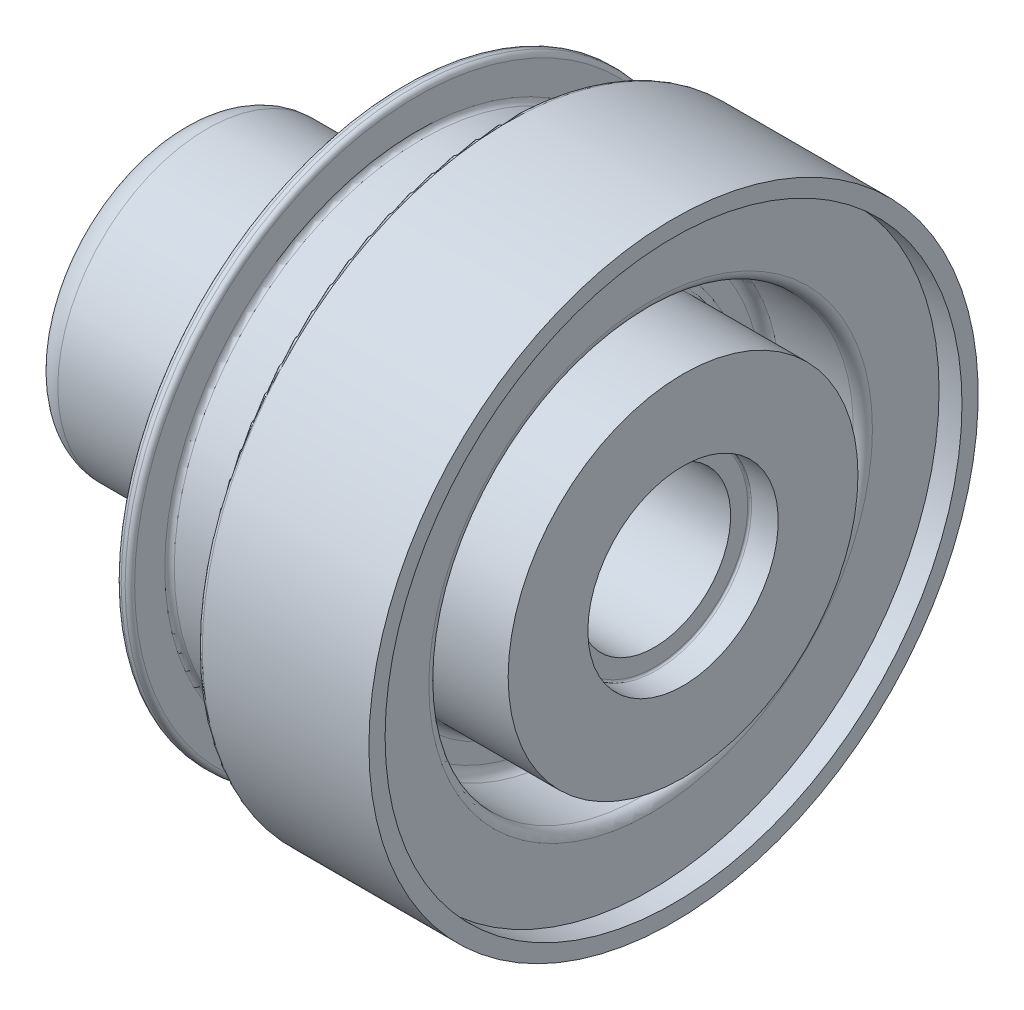
ISO-10303-21;
HEADER;
FILE_DESCRIPTION(('STEP AP214'),'2;1');
FILE_NAME('part.step','',(''),(''),'','','');
FILE_SCHEMA(('AUTOMOTIVE_DESIGN { 1 0 10303 214 1 1 1 1 }'));
ENDSEC;
DATA;
#1=APPLICATION_CONTEXT('core data for automotive mechanical design processes');
#2=APPLICATION_PROTOCOL_DEFINITION('international standard','automotive_design',2000,#1);
#3=PRODUCT_CONTEXT('',#1,'mechanical');
#4=PRODUCT('Part','Part','',(#3));
#5=PRODUCT_RELATED_PRODUCT_CATEGORY('part','',(#4));
#6=PRODUCT_DEFINITION_FORMATION('','',#4);
#7=PRODUCT_DEFINITION_CONTEXT('part definition',#1,'design');
#8=PRODUCT_DEFINITION('design','',#6,#7);
#9=PRODUCT_DEFINITION_SHAPE('','',#8);
#10=(LENGTH_UNIT() NAMED_UNIT(*) SI_UNIT(.MILLI.,.METRE.));
#11=(NAMED_UNIT(*) PLANE_ANGLE_UNIT() SI_UNIT($,.RADIAN.));
#12=(NAMED_UNIT(*) SI_UNIT($,.STERADIAN.) SOLID_ANGLE_UNIT());
#13=UNCERTAINTY_MEASURE_WITH_UNIT(LENGTH_MEASURE(1.E-05),#10,'distance_accuracy_value','');
#14=(GEOMETRIC_REPRESENTATION_CONTEXT(3) GLOBAL_UNCERTAINTY_ASSIGNED_CONTEXT((#13)) GLOBAL_UNIT_ASSIGNED_CONTEXT((#10,
#11,#12)) REPRESENTATION_CONTEXT('',''));
#15=CARTESIAN_POINT('',(0.,0.,0.));
#16=DIRECTION('',(0.,0.,1.));
#17=DIRECTION('',(1.,0.,0.));
#18=AXIS2_PLACEMENT_3D('',#15,#16,#17);
#19=CARTESIAN_POINT('',(-14.5,0.,-6.));
#20=DIRECTION('',(1.,0.,0.));
#21=DIRECTION('',(0.,0.,-1.));
#22=AXIS2_PLACEMENT_3D('',#19,#20,#21);
#23=PLANE('',#22);
#24=CARTESIAN_POINT('',(-14.5,0.,0.));
#25=DIRECTION('',(-1.,0.,0.));
#26=DIRECTION('',(0.,0.,1.));
#27=AXIS2_PLACEMENT_3D('',#24,#25,#26);
#28=CIRCLE('',#27,4.);
#29=CARTESIAN_POINT('',(-14.5,0.,4.));
#30=VERTEX_POINT('',#29);
#31=EDGE_CURVE('E133',#30,#30,#28,.T.);
#32=ORIENTED_EDGE('',*,*,#31,.F.);
#33=EDGE_LOOP('',(#32));
#34=FACE_BOUND('',#33,.T.);
#35=CARTESIAN_POINT('',(-14.5,0.,0.));
#36=DIRECTION('',(-1.,0.,0.));
#37=DIRECTION('',(0.,0.,1.));
#38=AXIS2_PLACEMENT_3D('',#35,#36,#37);
#39=CIRCLE('',#38,6.);
#40=CARTESIAN_POINT('',(-14.5,0.,6.));
#41=VERTEX_POINT('',#40);
#42=EDGE_CURVE('E10',#41,#41,#39,.T.);
#43=ORIENTED_EDGE('',*,*,#42,.T.);
#44=EDGE_LOOP('',(#43));
#45=FACE_BOUND('',#44,.T.);
#46=ADVANCED_FACE('F30',(#34,#45),#23,.F.);
#47=CARTESIAN_POINT('',(0.,0.,0.));
#48=DIRECTION('',(-1.,0.,0.));
#49=DIRECTION('',(0.,0.,1.));
#50=AXIS2_PLACEMENT_3D('',#47,#48,#49);
#51=CYLINDRICAL_SURFACE('',#50,6.);
#52=ORIENTED_EDGE('',*,*,#42,.F.);
#53=EDGE_LOOP('',(#52));
#54=FACE_BOUND('',#53,.T.);
#55=CARTESIAN_POINT('',(-26.5,0.,0.));
#56=DIRECTION('',(-1.,0.,0.));
#57=DIRECTION('',(0.,0.,1.));
#58=AXIS2_PLACEMENT_3D('',#55,#56,#57);
#59=CIRCLE('',#58,6.);
#60=CARTESIAN_POINT('',(-26.5,0.,6.));
#61=VERTEX_POINT('',#60);
#62=EDGE_CURVE('E36',#61,#61,#59,.T.);
#63=ORIENTED_EDGE('',*,*,#62,.T.);
#64=EDGE_LOOP('',(#63));
#65=FACE_BOUND('',#64,.T.);
#66=ADVANCED_FACE('F140',(#54,#65),#51,.F.);
#67=CARTESIAN_POINT('',(-26.5,0.,-6.33810288189224));
#68=DIRECTION('',(1.,0.,0.));
#69=DIRECTION('',(0.,0.,-1.));
#70=AXIS2_PLACEMENT_3D('',#67,#68,#69);
#71=PLANE('',#70);
#72=ORIENTED_EDGE('',*,*,#62,.F.);
#73=EDGE_LOOP('',(#72));
#74=FACE_BOUND('',#73,.T.);
#75=CARTESIAN_POINT('',(-26.5,0.,0.));
#76=DIRECTION('',(-1.,0.,0.));
#77=DIRECTION('',(0.,0.,1.));
#78=AXIS2_PLACEMENT_3D('',#75,#76,#77);
#79=CIRCLE('',#78,6.33810288189224);
#80=CARTESIAN_POINT('',(-26.5,0.,6.33810288189224));
#81=VERTEX_POINT('',#80);
#82=EDGE_CURVE('E40',#81,#81,#79,.T.);
#83=ORIENTED_EDGE('',*,*,#82,.T.);
#84=EDGE_LOOP('',(#83));
#85=FACE_BOUND('',#84,.T.);
#86=ADVANCED_FACE('F144',(#74,#85),#71,.F.);
#87=CARTESIAN_POINT('',(-25.,0.,0.));
#88=DIRECTION('',(-1.,0.,0.));
#89=DIRECTION('',(0.,0.,1.));
#90=AXIS2_PLACEMENT_3D('',#87,#88,#89);
#91=TOROIDAL_SURFACE('',#90,6.33810288189224,1.5);
#92=ORIENTED_EDGE('',*,*,#82,.F.);
#93=EDGE_LOOP('',(#92));
#94=FACE_BOUND('',#93,.T.);
#95=CARTESIAN_POINT('',(-25.,0.,0.));
#96=DIRECTION('',(-1.,0.,0.));
#97=DIRECTION('',(0.,0.,1.));
#98=AXIS2_PLACEMENT_3D('',#95,#96,#97);
#99=CIRCLE('',#98,7.83810288189224);
#100=CARTESIAN_POINT('',(-25.,0.,7.83810288189224));
#101=VERTEX_POINT('',#100);
#102=EDGE_CURVE('E44',#101,#101,#99,.T.);
#103=ORIENTED_EDGE('',*,*,#102,.T.);
#104=EDGE_LOOP('',(#103));
#105=FACE_BOUND('',#104,.T.);
#106=ADVANCED_FACE('F149',(#94,#105),#91,.T.);
#107=CARTESIAN_POINT('',(0.,0.,0.));
#108=DIRECTION('',(-1.,0.,0.));
#109=DIRECTION('',(0.,0.,1.));
#110=AXIS2_PLACEMENT_3D('',#107,#108,#109);
#111=CYLINDRICAL_SURFACE('',#110,7.83810288189224);
#112=ORIENTED_EDGE('',*,*,#102,.F.);
#113=EDGE_LOOP('',(#112));
#114=FACE_BOUND('',#113,.T.);
#115=CARTESIAN_POINT('',(-15.6202647500107,0.,0.));
#116=DIRECTION('',(-1.,0.,0.));
#117=DIRECTION('',(0.,0.,1.));
#118=AXIS2_PLACEMENT_3D('',#115,#116,#117);
#119=CIRCLE('',#118,7.83810288189224);
#120=CARTESIAN_POINT('',(-15.6202647500107,0.,7.83810288189224));
#121=VERTEX_POINT('',#120);
#122=EDGE_CURVE('E49',#121,#121,#119,.T.);
#123=ORIENTED_EDGE('',*,*,#122,.T.);
#124=EDGE_LOOP('',(#123));
#125=FACE_BOUND('',#124,.T.);
#126=ADVANCED_FACE('F155',(#114,#125),#111,.T.);
#127=CARTESIAN_POINT('',(-15.6202647500107,0.,0.));
#128=DIRECTION('',(-1.,0.,0.));
#129=DIRECTION('',(0.,0.,1.));
#130=AXIS2_PLACEMENT_3D('',#127,#128,#129);
#131=TOROIDAL_SURFACE('',#130,8.08810288189224,0.249999999999999);
#132=ORIENTED_EDGE('',*,*,#122,.F.);
#133=EDGE_LOOP('',(#132));
#134=FACE_BOUND('',#133,.T.);
#135=CARTESIAN_POINT('',(-15.3702647500107,0.,0.));
#136=DIRECTION('',(-1.,0.,0.));
#137=DIRECTION('',(0.,0.,1.));
#138=AXIS2_PLACEMENT_3D('',#135,#136,#137);
#139=CIRCLE('',#138,8.08810288189224);
#140=CARTESIAN_POINT('',(-15.3702647500107,0.,8.08810288189224));
#141=VERTEX_POINT('',#140);
#142=EDGE_CURVE('E52',#141,#141,#139,.T.);
#143=ORIENTED_EDGE('',*,*,#142,.T.);
#144=EDGE_LOOP('',(#143));
#145=FACE_BOUND('',#144,.T.);
#146=ADVANCED_FACE('F159',(#134,#145),#131,.F.);
#147=CARTESIAN_POINT('',(-15.3702647500107,0.,-13.4373337384986));
#148=DIRECTION('',(1.,0.,0.));
#149=DIRECTION('',(0.,0.,-1.));
#150=AXIS2_PLACEMENT_3D('',#147,#148,#149);
#151=PLANE('',#150);
#152=ORIENTED_EDGE('',*,*,#142,.F.);
#153=EDGE_LOOP('',(#152));
#154=FACE_BOUND('',#153,.T.);
#155=CARTESIAN_POINT('',(-15.3702647500107,0.,0.));
#156=DIRECTION('',(-1.,0.,0.));
#157=DIRECTION('',(0.,0.,1.));
#158=AXIS2_PLACEMENT_3D('',#155,#156,#157);
#159=CIRCLE('',#158,13.4373337384986);
#160=CARTESIAN_POINT('',(-15.3702647500107,0.,13.4373337384986));
#161=VERTEX_POINT('',#160);
#162=EDGE_CURVE('E55',#161,#161,#159,.T.);
#163=ORIENTED_EDGE('',*,*,#162,.T.);
#164=EDGE_LOOP('',(#163));
#165=FACE_BOUND('',#164,.T.);
#166=ADVANCED_FACE('F163',(#154,#165),#151,.F.);
#167=CARTESIAN_POINT('',(-15.1202647500107,0.,0.));
#168=DIRECTION('',(-1.,0.,0.));
#169=DIRECTION('',(0.,0.,1.));
#170=AXIS2_PLACEMENT_3D('',#167,#168,#169);
#171=TOROIDAL_SURFACE('',#170,13.4373337384986,0.249999999999996);
#172=ORIENTED_EDGE('',*,*,#162,.F.);
#173=EDGE_LOOP('',(#172));
#174=FACE_BOUND('',#173,.T.);
#175=CARTESIAN_POINT('',(-15.3443863576064,0.,0.));
#176=DIRECTION('',(-1.,0.,0.));
#177=DIRECTION('',(0.,0.,1.));
#178=AXIS2_PLACEMENT_3D('',#175,#176,#177);
#179=CIRCLE('',#178,13.548101536205);
#180=CARTESIAN_POINT('',(-15.3443863576064,0.,13.548101536205));
#181=VERTEX_POINT('',#180);
#182=EDGE_CURVE('E58',#181,#181,#179,.T.);
#183=ORIENTED_EDGE('',*,*,#182,.T.);
#184=EDGE_LOOP('',(#183));
#185=FACE_BOUND('',#184,.T.);
#186=ADVANCED_FACE('F167',(#174,#185),#171,.T.);
#187=CARTESIAN_POINT('',(-14.6560840134625,0.,0.));
#188=DIRECTION('',(1.,0.,0.));
#189=DIRECTION('',(0.,0.,-1.));
#190=AXIS2_PLACEMENT_3D('',#187,#188,#189);
#191=CONICAL_SURFACE('',#190,14.9407754998986,1.11177473351877);
#192=ORIENTED_EDGE('',*,*,#182,.F.);
#193=EDGE_LOOP('',(#192));
#194=FACE_BOUND('',#193,.T.);
#195=CARTESIAN_POINT('',(-14.6560840134625,0.,0.));
#196=DIRECTION('',(-1.,0.,0.));
#197=DIRECTION('',(0.,0.,1.));
#198=AXIS2_PLACEMENT_3D('',#195,#196,#197);
#199=CIRCLE('',#198,14.9407754998986);
#200=CARTESIAN_POINT('',(-14.6560840134625,0.,14.9407754998986));
#201=VERTEX_POINT('',#200);
#202=EDGE_CURVE('E61',#201,#201,#199,.T.);
#203=ORIENTED_EDGE('',*,*,#202,.T.);
#204=EDGE_LOOP('',(#203));
#205=FACE_BOUND('',#204,.T.);
#206=ADVANCED_FACE('F171',(#194,#205),#191,.T.);
#207=CARTESIAN_POINT('',(-14.4319624058668,0.,0.));
#208=DIRECTION('',(-1.,0.,0.));
#209=DIRECTION('',(0.,0.,1.));
#210=AXIS2_PLACEMENT_3D('',#207,#208,#209);
#211=TOROIDAL_SURFACE('',#210,14.8300077021922,0.249999999999999);
#212=ORIENTED_EDGE('',*,*,#202,.F.);
#213=EDGE_LOOP('',(#212));
#214=FACE_BOUND('',#213,.T.);
#215=CARTESIAN_POINT('',(-14.43,0.,0.));
#216=DIRECTION('',(-1.,0.,0.));
#217=DIRECTION('',(0.,0.,1.));
#218=AXIS2_PLACEMENT_3D('',#215,#216,#217);
#219=CIRCLE('',#218,15.08);
#220=CARTESIAN_POINT('',(-14.43,0.,15.08));
#221=VERTEX_POINT('',#220);
#222=EDGE_CURVE('E64',#221,#221,#219,.T.);
#223=ORIENTED_EDGE('',*,*,#222,.T.);
#224=EDGE_LOOP('',(#223));
#225=FACE_BOUND('',#224,.T.);
#226=ADVANCED_FACE('F175',(#214,#225),#211,.T.);
#227=CARTESIAN_POINT('',(0.,0.,0.));
#228=DIRECTION('',(-1.,0.,0.));
#229=DIRECTION('',(0.,0.,1.));
#230=AXIS2_PLACEMENT_3D('',#227,#228,#229);
#231=CYLINDRICAL_SURFACE('',#230,15.08);
#232=ORIENTED_EDGE('',*,*,#222,.F.);
#233=EDGE_LOOP('',(#232));
#234=FACE_BOUND('',#233,.T.);
#235=CARTESIAN_POINT('',(-14.22,0.,0.));
#236=DIRECTION('',(-1.,0.,0.));
#237=DIRECTION('',(0.,0.,1.));
#238=AXIS2_PLACEMENT_3D('',#235,#236,#237);
#239=CIRCLE('',#238,15.08);
#240=CARTESIAN_POINT('',(-14.22,0.,15.08));
#241=VERTEX_POINT('',#240);
#242=EDGE_CURVE('E67',#241,#241,#239,.T.);
#243=ORIENTED_EDGE('',*,*,#242,.T.);
#244=EDGE_LOOP('',(#243));
#245=FACE_BOUND('',#244,.T.);
#246=ADVANCED_FACE('F179',(#234,#245),#231,.T.);
#247=CARTESIAN_POINT('',(-14.22,0.,0.));
#248=DIRECTION('',(-1.,0.,0.));
#249=DIRECTION('',(0.,0.,1.));
#250=AXIS2_PLACEMENT_3D('',#247,#248,#249);
#251=TOROIDAL_SURFACE('',#250,14.83,0.250000000000001);
#252=ORIENTED_EDGE('',*,*,#242,.F.);
#253=EDGE_LOOP('',(#252));
#254=FACE_BOUND('',#253,.T.);
#255=CARTESIAN_POINT('',(-13.97,0.,0.));
#256=DIRECTION('',(-1.,0.,0.));
#257=DIRECTION('',(0.,0.,1.));
#258=AXIS2_PLACEMENT_3D('',#255,#256,#257);
#259=CIRCLE('',#258,14.83);
#260=CARTESIAN_POINT('',(-13.97,0.,14.83));
#261=VERTEX_POINT('',#260);
#262=EDGE_CURVE('E70',#261,#261,#259,.T.);
#263=ORIENTED_EDGE('',*,*,#262,.T.);
#264=EDGE_LOOP('',(#263));
#265=FACE_BOUND('',#264,.T.);
#266=ADVANCED_FACE('F183',(#254,#265),#251,.T.);
#267=CARTESIAN_POINT('',(-13.97,0.,-13.25));
#268=DIRECTION('',(-1.,0.,0.));
#269=DIRECTION('',(0.,0.,1.));
#270=AXIS2_PLACEMENT_3D('',#267,#268,#269);
#271=PLANE('',#270);
#272=ORIENTED_EDGE('',*,*,#262,.F.);
#273=EDGE_LOOP('',(#272));
#274=FACE_BOUND('',#273,.T.);
#275=CARTESIAN_POINT('',(-13.97,0.,0.));
#276=DIRECTION('',(-1.,0.,0.));
#277=DIRECTION('',(0.,0.,1.));
#278=AXIS2_PLACEMENT_3D('',#275,#276,#277);
#279=CIRCLE('',#278,13.25);
#280=CARTESIAN_POINT('',(-13.97,0.,13.25));
#281=VERTEX_POINT('',#280);
#282=EDGE_CURVE('E73',#281,#281,#279,.T.);
#283=ORIENTED_EDGE('',*,*,#282,.T.);
#284=EDGE_LOOP('',(#283));
#285=FACE_BOUND('',#284,.T.);
#286=ADVANCED_FACE('F187',(#274,#285),#271,.F.);
#287=CARTESIAN_POINT('',(-13.72,0.,0.));
#288=DIRECTION('',(-1.,0.,0.));
#289=DIRECTION('',(0.,0.,1.));
#290=AXIS2_PLACEMENT_3D('',#287,#288,#289);
#291=TOROIDAL_SURFACE('',#290,13.25,0.249999999999999);
#292=ORIENTED_EDGE('',*,*,#282,.F.);
#293=EDGE_LOOP('',(#292));
#294=FACE_BOUND('',#293,.T.);
#295=CARTESIAN_POINT('',(-13.72,0.,0.));
#296=DIRECTION('',(-1.,0.,0.));
#297=DIRECTION('',(0.,0.,1.));
#298=AXIS2_PLACEMENT_3D('',#295,#296,#297);
#299=CIRCLE('',#298,13.);
#300=CARTESIAN_POINT('',(-13.72,0.,13.));
#301=VERTEX_POINT('',#300);
#302=EDGE_CURVE('E76',#301,#301,#299,.T.);
#303=ORIENTED_EDGE('',*,*,#302,.T.);
#304=EDGE_LOOP('',(#303));
#305=FACE_BOUND('',#304,.T.);
#306=ADVANCED_FACE('F191',(#294,#305),#291,.F.);
#307=CARTESIAN_POINT('',(0.,0.,0.));
#308=DIRECTION('',(-1.,0.,0.));
#309=DIRECTION('',(0.,0.,1.));
#310=AXIS2_PLACEMENT_3D('',#307,#308,#309);
#311=CYLINDRICAL_SURFACE('',#310,13.);
#312=ORIENTED_EDGE('',*,*,#302,.F.);
#313=EDGE_LOOP('',(#312));
#314=FACE_BOUND('',#313,.T.);
#315=CARTESIAN_POINT('',(-9.75,0.,0.));
#316=DIRECTION('',(-1.,0.,0.));
#317=DIRECTION('',(0.,0.,1.));
#318=AXIS2_PLACEMENT_3D('',#315,#316,#317);
#319=CIRCLE('',#318,13.);
#320=CARTESIAN_POINT('',(-9.75,0.,13.));
#321=VERTEX_POINT('',#320);
#322=EDGE_CURVE('E79',#321,#321,#319,.T.);
#323=ORIENTED_EDGE('',*,*,#322,.T.);
#324=EDGE_LOOP('',(#323));
#325=FACE_BOUND('',#324,.T.);
#326=ADVANCED_FACE('F195',(#314,#325),#311,.T.);
#327=CARTESIAN_POINT('',(-9.75,0.,0.));
#328=DIRECTION('',(-1.,0.,0.));
#329=DIRECTION('',(0.,0.,1.));
#330=AXIS2_PLACEMENT_3D('',#327,#328,#329);
#331=TOROIDAL_SURFACE('',#330,13.25,0.249999999999998);
#332=ORIENTED_EDGE('',*,*,#322,.F.);
#333=EDGE_LOOP('',(#332));
#334=FACE_BOUND('',#333,.T.);
#335=CARTESIAN_POINT('',(-9.5,0.,0.));
#336=DIRECTION('',(-1.,0.,0.));
#337=DIRECTION('',(0.,0.,1.));
#338=AXIS2_PLACEMENT_3D('',#335,#336,#337);
#339=CIRCLE('',#338,13.25);
#340=CARTESIAN_POINT('',(-9.5,0.,13.25));
#341=VERTEX_POINT('',#340);
#342=EDGE_CURVE('E82',#341,#341,#339,.T.);
#343=ORIENTED_EDGE('',*,*,#342,.T.);
#344=EDGE_LOOP('',(#343));
#345=FACE_BOUND('',#344,.T.);
#346=ADVANCED_FACE('F199',(#334,#345),#331,.F.);
#347=CARTESIAN_POINT('',(-9.5,0.,-15.75));
#348=DIRECTION('',(1.,0.,0.));
#349=DIRECTION('',(0.,0.,-1.));
#350=AXIS2_PLACEMENT_3D('',#347,#348,#349);
#351=PLANE('',#350);
#352=ORIENTED_EDGE('',*,*,#342,.F.);
#353=EDGE_LOOP('',(#352));
#354=FACE_BOUND('',#353,.T.);
#355=CARTESIAN_POINT('',(-9.5,0.,0.));
#356=DIRECTION('',(-1.,0.,0.));
#357=DIRECTION('',(0.,0.,1.));
#358=AXIS2_PLACEMENT_3D('',#355,#356,#357);
#359=CIRCLE('',#358,15.75);
#360=CARTESIAN_POINT('',(-9.5,0.,15.75));
#361=VERTEX_POINT('',#360);
#362=EDGE_CURVE('E85',#361,#361,#359,.T.);
#363=ORIENTED_EDGE('',*,*,#362,.T.);
#364=EDGE_LOOP('',(#363));
#365=FACE_BOUND('',#364,.T.);
#366=ADVANCED_FACE('F203',(#354,#365),#351,.F.);
#367=CARTESIAN_POINT('',(-9.25,0.,0.));
#368=DIRECTION('',(-1.,0.,0.));
#369=DIRECTION('',(0.,0.,1.));
#370=AXIS2_PLACEMENT_3D('',#367,#368,#369);
#371=TOROIDAL_SURFACE('',#370,15.75,0.250000000000002);
#372=ORIENTED_EDGE('',*,*,#362,.F.);
#373=EDGE_LOOP('',(#372));
#374=FACE_BOUND('',#373,.T.);
#375=CARTESIAN_POINT('',(-9.25,0.,0.));
#376=DIRECTION('',(-1.,0.,0.));
#377=DIRECTION('',(0.,0.,1.));
#378=AXIS2_PLACEMENT_3D('',#375,#376,#377);
#379=CIRCLE('',#378,16.);
#380=CARTESIAN_POINT('',(-9.25,0.,16.));
#381=VERTEX_POINT('',#380);
#382=EDGE_CURVE('E88',#381,#381,#379,.T.);
#383=ORIENTED_EDGE('',*,*,#382,.T.);
#384=EDGE_LOOP('',(#383));
#385=FACE_BOUND('',#384,.T.);
#386=ADVANCED_FACE('F207',(#374,#385),#371,.T.);
#387=CARTESIAN_POINT('',(0.,0.,0.));
#388=DIRECTION('',(-1.,0.,0.));
#389=DIRECTION('',(0.,0.,1.));
#390=AXIS2_PLACEMENT_3D('',#387,#388,#389);
#391=CYLINDRICAL_SURFACE('',#390,16.);
#392=ORIENTED_EDGE('',*,*,#382,.F.);
#393=EDGE_LOOP('',(#392));
#394=FACE_BOUND('',#393,.T.);
#395=CARTESIAN_POINT('',(-0.500000000000003,0.,0.));
#396=DIRECTION('',(-1.,0.,0.));
#397=DIRECTION('',(0.,0.,1.));
#398=AXIS2_PLACEMENT_3D('',#395,#396,#397);
#399=CIRCLE('',#398,16.);
#400=CARTESIAN_POINT('',(-0.500000000000003,0.,16.));
#401=VERTEX_POINT('',#400);
#402=EDGE_CURVE('E91',#401,#401,#399,.T.);
#403=ORIENTED_EDGE('',*,*,#402,.T.);
#404=EDGE_LOOP('',(#403));
#405=FACE_BOUND('',#404,.T.);
#406=ADVANCED_FACE('F211',(#394,#405),#391,.T.);
#407=CARTESIAN_POINT('',(-0.500000000000002,0.,-15.1490463264543));
#408=DIRECTION('',(-1.,0.,0.));
#409=DIRECTION('',(0.,0.,1.));
#410=AXIS2_PLACEMENT_3D('',#407,#408,#409);
#411=PLANE('',#410);
#412=ORIENTED_EDGE('',*,*,#402,.F.);
#413=EDGE_LOOP('',(#412));
#414=FACE_BOUND('',#413,.T.);
#415=CARTESIAN_POINT('',(-0.5,0.,0.));
#416=DIRECTION('',(-1.,0.,0.));
#417=DIRECTION('',(0.,0.,1.));
#418=AXIS2_PLACEMENT_3D('',#415,#416,#417);
#419=CIRCLE('',#418,15.1490463264543);
#420=CARTESIAN_POINT('',(-0.5,0.,15.1490463264543));
#421=VERTEX_POINT('',#420);
#422=EDGE_CURVE('E94',#421,#421,#419,.T.);
#423=ORIENTED_EDGE('',*,*,#422,.T.);
#424=EDGE_LOOP('',(#423));
#425=FACE_BOUND('',#424,.T.);
#426=ADVANCED_FACE('F215',(#414,#425),#411,.F.);
#427=CARTESIAN_POINT('',(0.,0.,0.));
#428=DIRECTION('',(-1.,0.,0.));
#429=DIRECTION('',(0.,0.,1.));
#430=AXIS2_PLACEMENT_3D('',#427,#428,#429);
#431=CYLINDRICAL_SURFACE('',#430,15.1490463264543);
#432=ORIENTED_EDGE('',*,*,#422,.F.);
#433=EDGE_LOOP('',(#432));
#434=FACE_BOUND('',#433,.T.);
#435=CARTESIAN_POINT('',(-1.70357114141986,0.,0.));
#436=DIRECTION('',(-1.,0.,0.));
#437=DIRECTION('',(0.,0.,1.));
#438=AXIS2_PLACEMENT_3D('',#435,#436,#437);
#439=CIRCLE('',#438,15.1490463264543);
#440=CARTESIAN_POINT('',(-1.70357114141986,0.,15.1490463264543));
#441=VERTEX_POINT('',#440);
#442=EDGE_CURVE('E97',#441,#441,#439,.T.);
#443=ORIENTED_EDGE('',*,*,#442,.T.);
#444=EDGE_LOOP('',(#443));
#445=FACE_BOUND('',#444,.T.);
#446=ADVANCED_FACE('F219',(#434,#445),#431,.F.);
#447=CARTESIAN_POINT('',(-1.70357114141986,0.,-11.6490463264543));
#448=DIRECTION('',(-1.,0.,0.));
#449=DIRECTION('',(0.,0.,1.));
#450=AXIS2_PLACEMENT_3D('',#447,#448,#449);
#451=PLANE('',#450);
#452=ORIENTED_EDGE('',*,*,#442,.F.);
#453=EDGE_LOOP('',(#452));
#454=FACE_BOUND('',#453,.T.);
#455=CARTESIAN_POINT('',(-1.70357114141986,0.,0.));
#456=DIRECTION('',(-1.,0.,0.));
#457=DIRECTION('',(0.,0.,1.));
#458=AXIS2_PLACEMENT_3D('',#455,#456,#457);
#459=CIRCLE('',#458,11.6490463264543);
#460=CARTESIAN_POINT('',(-1.70357114141986,0.,11.6490463264543));
#461=VERTEX_POINT('',#460);
#462=EDGE_CURVE('E100',#461,#461,#459,.T.);
#463=ORIENTED_EDGE('',*,*,#462,.T.);
#464=EDGE_LOOP('',(#463));
#465=FACE_BOUND('',#464,.T.);
#466=ADVANCED_FACE('F223',(#454,#465),#451,.F.);
#467=CARTESIAN_POINT('',(-2.20357114141986,0.,0.));
#468=DIRECTION('',(-1.,0.,0.));
#469=DIRECTION('',(0.,0.,1.));
#470=AXIS2_PLACEMENT_3D('',#467,#468,#469);
#471=TOROIDAL_SURFACE('',#470,11.6490463264543,0.5);
#472=ORIENTED_EDGE('',*,*,#462,.F.);
#473=EDGE_LOOP('',(#472));
#474=FACE_BOUND('',#473,.T.);
#475=CARTESIAN_POINT('',(-2.20357114141986,0.,0.));
#476=DIRECTION('',(-1.,0.,0.));
#477=DIRECTION('',(0.,0.,1.));
#478=AXIS2_PLACEMENT_3D('',#475,#476,#477);
#479=CIRCLE('',#478,11.1490463264543);
#480=CARTESIAN_POINT('',(-2.20357114141986,0.,11.1490463264543));
#481=VERTEX_POINT('',#480);
#482=EDGE_CURVE('E103',#481,#481,#479,.T.);
#483=ORIENTED_EDGE('',*,*,#482,.T.);
#484=EDGE_LOOP('',(#483));
#485=FACE_BOUND('',#484,.T.);
#486=ADVANCED_FACE('F227',(#474,#485),#471,.T.);
#487=CARTESIAN_POINT('',(0.,0.,0.));
#488=DIRECTION('',(-1.,0.,0.));
#489=DIRECTION('',(0.,0.,1.));
#490=AXIS2_PLACEMENT_3D('',#487,#488,#489);
#491=CYLINDRICAL_SURFACE('',#490,11.1490463264543);
#492=ORIENTED_EDGE('',*,*,#482,.F.);
#493=EDGE_LOOP('',(#492));
#494=FACE_BOUND('',#493,.T.);
#495=CARTESIAN_POINT('',(-6.07558299388346,0.,0.));
#496=DIRECTION('',(-1.,0.,0.));
#497=DIRECTION('',(0.,0.,1.));
#498=AXIS2_PLACEMENT_3D('',#495,#496,#497);
#499=CIRCLE('',#498,11.1490463264543);
#500=CARTESIAN_POINT('',(-6.07558299388346,0.,11.1490463264543));
#501=VERTEX_POINT('',#500);
#502=EDGE_CURVE('E106',#501,#501,#499,.T.);
#503=ORIENTED_EDGE('',*,*,#502,.T.);
#504=EDGE_LOOP('',(#503));
#505=FACE_BOUND('',#504,.T.);
#506=ADVANCED_FACE('F231',(#494,#505),#491,.F.);
#507=CARTESIAN_POINT('',(-6.07558299388346,0.,0.));
#508=DIRECTION('',(-1.,0.,0.));
#509=DIRECTION('',(0.,0.,1.));
#510=AXIS2_PLACEMENT_3D('',#507,#508,#509);
#511=TOROIDAL_SURFACE('',#510,10.6490463264543,0.5);
#512=ORIENTED_EDGE('',*,*,#502,.F.);
#513=EDGE_LOOP('',(#512));
#514=FACE_BOUND('',#513,.T.);
#515=CARTESIAN_POINT('',(-6.57558299388345,0.,0.));
#516=DIRECTION('',(-1.,0.,0.));
#517=DIRECTION('',(0.,0.,1.));
#518=AXIS2_PLACEMENT_3D('',#515,#516,#517);
#519=CIRCLE('',#518,10.6490463264543);
#520=CARTESIAN_POINT('',(-6.57558299388345,0.,10.6490463264543));
#521=VERTEX_POINT('',#520);
#522=EDGE_CURVE('E109',#521,#521,#519,.T.);
#523=ORIENTED_EDGE('',*,*,#522,.T.);
#524=EDGE_LOOP('',(#523));
#525=FACE_BOUND('',#524,.T.);
#526=ADVANCED_FACE('F235',(#514,#525),#511,.F.);
#527=CARTESIAN_POINT('',(-6.57558299388345,0.,-9.68569826650628));
#528=DIRECTION('',(-1.,0.,0.));
#529=DIRECTION('',(0.,0.,1.));
#530=AXIS2_PLACEMENT_3D('',#527,#528,#529);
#531=PLANE('',#530);
#532=ORIENTED_EDGE('',*,*,#522,.F.);
#533=EDGE_LOOP('',(#532));
#534=FACE_BOUND('',#533,.T.);
#535=CARTESIAN_POINT('',(-6.57558299388345,0.,0.));
#536=DIRECTION('',(-1.,0.,0.));
#537=DIRECTION('',(0.,0.,1.));
#538=AXIS2_PLACEMENT_3D('',#535,#536,#537);
#539=CIRCLE('',#538,9.68569826650628);
#540=CARTESIAN_POINT('',(-6.57558299388345,0.,9.68569826650628));
#541=VERTEX_POINT('',#540);
#542=EDGE_CURVE('E112',#541,#541,#539,.T.);
#543=ORIENTED_EDGE('',*,*,#542,.T.);
#544=EDGE_LOOP('',(#543));
#545=FACE_BOUND('',#544,.T.);
#546=ADVANCED_FACE('F239',(#534,#545),#531,.F.);
#547=CARTESIAN_POINT('',(-6.07558299388345,0.,0.));
#548=DIRECTION('',(-1.,0.,0.));
#549=DIRECTION('',(0.,0.,1.));
#550=AXIS2_PLACEMENT_3D('',#547,#548,#549);
#551=TOROIDAL_SURFACE('',#550,9.68569826650628,0.5);
#552=ORIENTED_EDGE('',*,*,#542,.F.);
#553=EDGE_LOOP('',(#552));
#554=FACE_BOUND('',#553,.T.);
#555=CARTESIAN_POINT('',(-6.07558299388346,0.,0.));
#556=DIRECTION('',(-1.,0.,0.));
#557=DIRECTION('',(0.,0.,1.));
#558=AXIS2_PLACEMENT_3D('',#555,#556,#557);
#559=CIRCLE('',#558,9.18569826650628);
#560=CARTESIAN_POINT('',(-6.07558299388346,0.,9.18569826650628));
#561=VERTEX_POINT('',#560);
#562=EDGE_CURVE('E115',#561,#561,#559,.T.);
#563=ORIENTED_EDGE('',*,*,#562,.T.);
#564=EDGE_LOOP('',(#563));
#565=FACE_BOUND('',#564,.T.);
#566=ADVANCED_FACE('F243',(#554,#565),#551,.F.);
#567=CARTESIAN_POINT('',(0.,0.,0.));
#568=DIRECTION('',(-1.,0.,0.));
#569=DIRECTION('',(0.,0.,1.));
#570=AXIS2_PLACEMENT_3D('',#567,#568,#569);
#571=CYLINDRICAL_SURFACE('',#570,9.18569826650628);
#572=ORIENTED_EDGE('',*,*,#562,.F.);
#573=EDGE_LOOP('',(#572));
#574=FACE_BOUND('',#573,.T.);
#575=CARTESIAN_POINT('',(0.,0.,0.));
#576=DIRECTION('',(-1.,0.,0.));
#577=DIRECTION('',(0.,0.,1.));
#578=AXIS2_PLACEMENT_3D('',#575,#576,#577);
#579=CIRCLE('',#578,9.18569826650628);
#580=CARTESIAN_POINT('',(0.,0.,9.18569826650628));
#581=VERTEX_POINT('',#580);
#582=EDGE_CURVE('E118',#581,#581,#579,.T.);
#583=ORIENTED_EDGE('',*,*,#582,.T.);
#584=EDGE_LOOP('',(#583));
#585=FACE_BOUND('',#584,.T.);
#586=ADVANCED_FACE('F247',(#574,#585),#571,.T.);
#587=CARTESIAN_POINT('',(0.,0.,-5.));
#588=DIRECTION('',(-1.,0.,0.));
#589=DIRECTION('',(0.,0.,1.));
#590=AXIS2_PLACEMENT_3D('',#587,#588,#589);
#591=PLANE('',#590);
#592=ORIENTED_EDGE('',*,*,#582,.F.);
#593=EDGE_LOOP('',(#592));
#594=FACE_BOUND('',#593,.T.);
#595=CARTESIAN_POINT('',(0.,0.,0.));
#596=DIRECTION('',(-1.,0.,0.));
#597=DIRECTION('',(0.,0.,1.));
#598=AXIS2_PLACEMENT_3D('',#595,#596,#597);
#599=CIRCLE('',#598,5.);
#600=CARTESIAN_POINT('',(0.,0.,5.));
#601=VERTEX_POINT('',#600);
#602=EDGE_CURVE('E121',#601,#601,#599,.T.);
#603=ORIENTED_EDGE('',*,*,#602,.T.);
#604=EDGE_LOOP('',(#603));
#605=FACE_BOUND('',#604,.T.);
#606=ADVANCED_FACE('F251',(#594,#605),#591,.F.);
#607=CARTESIAN_POINT('',(0.,0.,0.));
#608=DIRECTION('',(-1.,0.,0.));
#609=DIRECTION('',(0.,0.,1.));
#610=AXIS2_PLACEMENT_3D('',#607,#608,#609);
#611=CYLINDRICAL_SURFACE('',#610,5.);
#612=ORIENTED_EDGE('',*,*,#602,.F.);
#613=EDGE_LOOP('',(#612));
#614=FACE_BOUND('',#613,.T.);
#615=CARTESIAN_POINT('',(-1.4,0.,0.));
#616=DIRECTION('',(-1.,0.,0.));
#617=DIRECTION('',(0.,0.,1.));
#618=AXIS2_PLACEMENT_3D('',#615,#616,#617);
#619=CIRCLE('',#618,5.);
#620=CARTESIAN_POINT('',(-1.4,0.,5.));
#621=VERTEX_POINT('',#620);
#622=EDGE_CURVE('E124',#621,#621,#619,.T.);
#623=ORIENTED_EDGE('',*,*,#622,.T.);
#624=EDGE_LOOP('',(#623));
#625=FACE_BOUND('',#624,.T.);
#626=ADVANCED_FACE('F255',(#614,#625),#611,.F.);
#627=CARTESIAN_POINT('',(-1.4,0.,0.));
#628=DIRECTION('',(-1.,0.,0.));
#629=DIRECTION('',(0.,0.,1.));
#630=AXIS2_PLACEMENT_3D('',#627,#628,#629);
#631=TOROIDAL_SURFACE('',#630,4.9,0.1);
#632=ORIENTED_EDGE('',*,*,#622,.F.);
#633=EDGE_LOOP('',(#632));
#634=FACE_BOUND('',#633,.T.);
#635=CARTESIAN_POINT('',(-1.5,0.,0.));
#636=DIRECTION('',(-1.,0.,0.));
#637=DIRECTION('',(0.,0.,1.));
#638=AXIS2_PLACEMENT_3D('',#635,#636,#637);
#639=CIRCLE('',#638,4.9);
#640=CARTESIAN_POINT('',(-1.5,0.,4.9));
#641=VERTEX_POINT('',#640);
#642=EDGE_CURVE('E127',#641,#641,#639,.T.);
#643=ORIENTED_EDGE('',*,*,#642,.T.);
#644=EDGE_LOOP('',(#643));
#645=FACE_BOUND('',#644,.T.);
#646=ADVANCED_FACE('F259',(#634,#645),#631,.F.);
#647=CARTESIAN_POINT('',(-1.5,0.,-4.));
#648=DIRECTION('',(-1.,0.,0.));
#649=DIRECTION('',(0.,0.,1.));
#650=AXIS2_PLACEMENT_3D('',#647,#648,#649);
#651=PLANE('',#650);
#652=ORIENTED_EDGE('',*,*,#642,.F.);
#653=EDGE_LOOP('',(#652));
#654=FACE_BOUND('',#653,.T.);
#655=CARTESIAN_POINT('',(-1.5,0.,0.));
#656=DIRECTION('',(-1.,0.,0.));
#657=DIRECTION('',(0.,0.,1.));
#658=AXIS2_PLACEMENT_3D('',#655,#656,#657);
#659=CIRCLE('',#658,4.);
#660=CARTESIAN_POINT('',(-1.5,0.,4.));
#661=VERTEX_POINT('',#660);
#662=EDGE_CURVE('E130',#661,#661,#659,.T.);
#663=ORIENTED_EDGE('',*,*,#662,.T.);
#664=EDGE_LOOP('',(#663));
#665=FACE_BOUND('',#664,.T.);
#666=ADVANCED_FACE('F263',(#654,#665),#651,.F.);
#667=CARTESIAN_POINT('',(0.,0.,0.));
#668=DIRECTION('',(-1.,0.,0.));
#669=DIRECTION('',(0.,0.,1.));
#670=AXIS2_PLACEMENT_3D('',#667,#668,#669);
#671=CYLINDRICAL_SURFACE('',#670,4.);
#672=ORIENTED_EDGE('',*,*,#662,.F.);
#673=EDGE_LOOP('',(#672));
#674=FACE_BOUND('',#673,.T.);
#675=ORIENTED_EDGE('',*,*,#31,.T.);
#676=EDGE_LOOP('',(#675));
#677=FACE_BOUND('',#676,.T.);
#678=ADVANCED_FACE('F137',(#674,#677),#671,.F.);
#679=CLOSED_SHELL('',(#46,#66,#86,#106,#126,#146,#166,#186,#206,#226,#246,#266,#286,#306,#326,
#346,#366,#386,#406,#426,#446,#466,#486,#506,#526,#546,#566,#586,#606,#626,#646,#666,#678));
#680=MANIFOLD_SOLID_BREP('B2',#679);
#681=ADVANCED_BREP_SHAPE_REPRESENTATION('',(#18,#680),#14);
#682=SHAPE_DEFINITION_REPRESENTATION(#9,#681);
ENDSEC;
END-ISO-10303-21;
